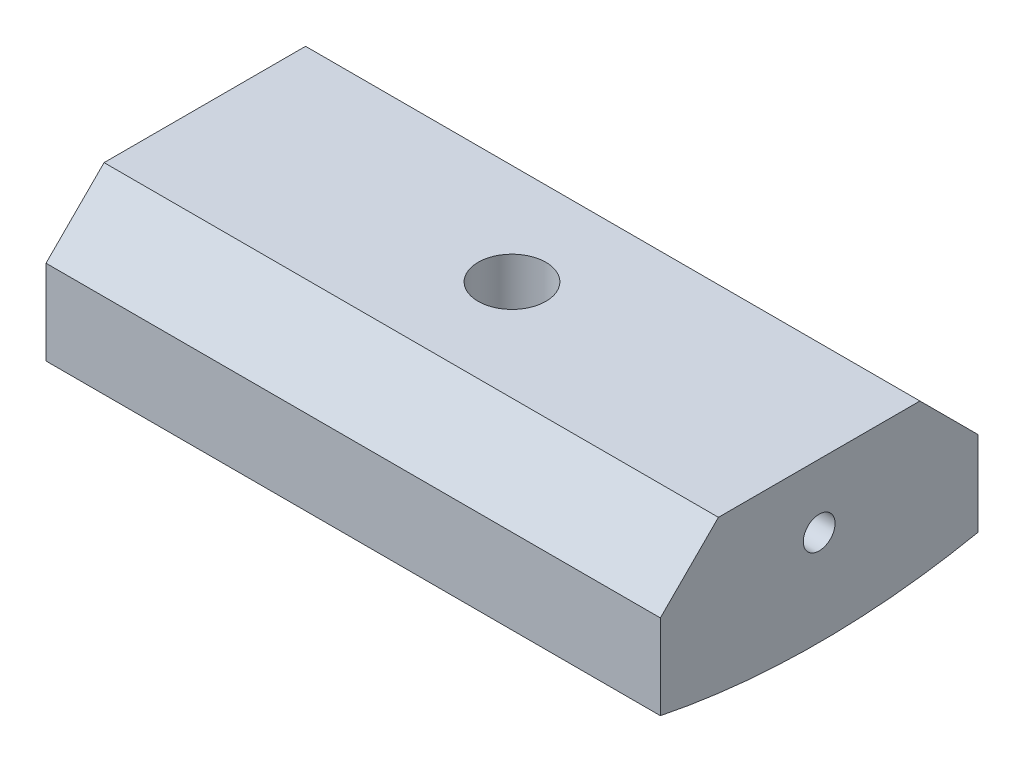
ISO-10303-21;
HEADER;
FILE_DESCRIPTION(('STEP AP214'),'2;1');
FILE_NAME('part.step','',(''),(''),'','','');
FILE_SCHEMA(('AUTOMOTIVE_DESIGN { 1 0 10303 214 1 1 1 1 }'));
ENDSEC;
DATA;
#1=APPLICATION_CONTEXT('core data for automotive mechanical design processes');
#2=APPLICATION_PROTOCOL_DEFINITION('international standard','automotive_design',2000,#1);
#3=PRODUCT_CONTEXT('',#1,'mechanical');
#4=PRODUCT('Part','Part','',(#3));
#5=PRODUCT_RELATED_PRODUCT_CATEGORY('part','',(#4));
#6=PRODUCT_DEFINITION_FORMATION('','',#4);
#7=PRODUCT_DEFINITION_CONTEXT('part definition',#1,'design');
#8=PRODUCT_DEFINITION('design','',#6,#7);
#9=PRODUCT_DEFINITION_SHAPE('','',#8);
#10=(LENGTH_UNIT() NAMED_UNIT(*) SI_UNIT(.MILLI.,.METRE.));
#11=(NAMED_UNIT(*) PLANE_ANGLE_UNIT() SI_UNIT($,.RADIAN.));
#12=(NAMED_UNIT(*) SI_UNIT($,.STERADIAN.) SOLID_ANGLE_UNIT());
#13=UNCERTAINTY_MEASURE_WITH_UNIT(LENGTH_MEASURE(1.E-05),#10,'distance_accuracy_value','');
#14=(GEOMETRIC_REPRESENTATION_CONTEXT(3) GLOBAL_UNCERTAINTY_ASSIGNED_CONTEXT((#13)) GLOBAL_UNIT_ASSIGNED_CONTEXT((#10,
#11,#12)) REPRESENTATION_CONTEXT('',''));
#15=CARTESIAN_POINT('',(0.,0.,0.));
#16=DIRECTION('',(0.,0.,1.));
#17=DIRECTION('',(1.,0.,0.));
#18=AXIS2_PLACEMENT_3D('',#15,#16,#17);
#19=CARTESIAN_POINT('',(58.024,-65.4846922834953,-15.));
#20=DIRECTION('',(0.,-0.707106781186551,0.707106781186544));
#21=DIRECTION('',(0.,-0.707106781186544,-0.707106781186551));
#22=AXIS2_PLACEMENT_3D('',#19,#20,#21);
#23=PLANE('',#22);
#24=DIRECTION('',(0.,0.707106781186544,0.707106781186551));
#25=VECTOR('',#24,1.);
#26=CARTESIAN_POINT('',(0.,-65.4846922834953,-15.));
#27=LINE('',#26,#25);
#28=CARTESIAN_POINT('',(0.,-65.4846922834953,-15.));
#29=VERTEX_POINT('',#28);
#30=CARTESIAN_POINT('',(0.,-60.,-9.5153077165046));
#31=VERTEX_POINT('',#30);
#32=EDGE_CURVE('E122',#29,#31,#27,.T.);
#33=ORIENTED_EDGE('',*,*,#32,.T.);
#34=DIRECTION('',(-1.,0.,0.));
#35=VECTOR('',#34,1.);
#36=CARTESIAN_POINT('',(58.024,-60.,-9.5153077165046));
#37=LINE('',#36,#35);
#38=CARTESIAN_POINT('',(58.024,-60.,-9.5153077165046));
#39=VERTEX_POINT('',#38);
#40=EDGE_CURVE('E45',#39,#31,#37,.T.);
#41=ORIENTED_EDGE('',*,*,#40,.F.);
#42=DIRECTION('',(0.,0.707106781186544,0.707106781186551));
#43=VECTOR('',#42,1.);
#44=CARTESIAN_POINT('',(58.024,-65.4846922834953,-15.));
#45=LINE('',#44,#43);
#46=CARTESIAN_POINT('',(58.024,-65.4846922834953,-15.));
#47=VERTEX_POINT('',#46);
#48=EDGE_CURVE('E133',#47,#39,#45,.T.);
#49=ORIENTED_EDGE('',*,*,#48,.F.);
#50=DIRECTION('',(-1.,0.,0.));
#51=VECTOR('',#50,1.);
#52=CARTESIAN_POINT('',(58.024,-65.4846922834953,-15.));
#53=LINE('',#52,#51);
#54=EDGE_CURVE('E118',#47,#29,#53,.T.);
#55=ORIENTED_EDGE('',*,*,#54,.T.);
#56=EDGE_LOOP('',(#33,#41,#49,#55));
#57=FACE_BOUND('',#56,.T.);
#58=ADVANCED_FACE('F33',(#57),#23,.F.);
#59=CARTESIAN_POINT('',(58.024,-60.,0.));
#60=DIRECTION('',(0.,-1.,0.));
#61=DIRECTION('',(0.,0.,-1.));
#62=AXIS2_PLACEMENT_3D('',#59,#60,#61);
#63=PLANE('',#62);
#64=CARTESIAN_POINT('',(29.012,-60.,0.));
#65=DIRECTION('',(0.,1.,0.));
#66=DIRECTION('',(0.,0.,1.));
#67=AXIS2_PLACEMENT_3D('',#64,#65,#66);
#68=CIRCLE('',#67,3.20000000000001);
#69=CARTESIAN_POINT('',(29.012,-60.,3.20000000000002));
#70=VERTEX_POINT('',#69);
#71=EDGE_CURVE('E126',#70,#70,#68,.T.);
#72=ORIENTED_EDGE('',*,*,#71,.F.);
#73=EDGE_LOOP('',(#72));
#74=FACE_BOUND('',#73,.T.);
#75=DIRECTION('',(0.,0.,1.));
#76=VECTOR('',#75,1.);
#77=CARTESIAN_POINT('',(0.,-60.,0.));
#78=LINE('',#77,#76);
#79=CARTESIAN_POINT('',(0.,-60.,9.51530771650459));
#80=VERTEX_POINT('',#79);
#81=EDGE_CURVE('E125',#31,#80,#78,.T.);
#82=ORIENTED_EDGE('',*,*,#81,.T.);
#83=DIRECTION('',(-1.,0.,0.));
#84=VECTOR('',#83,1.);
#85=CARTESIAN_POINT('',(58.024,-60.,9.51530771650459));
#86=LINE('',#85,#84);
#87=CARTESIAN_POINT('',(58.024,-60.,9.51530771650459));
#88=VERTEX_POINT('',#87);
#89=EDGE_CURVE('E137',#88,#80,#86,.T.);
#90=ORIENTED_EDGE('',*,*,#89,.F.);
#91=DIRECTION('',(0.,0.,1.));
#92=VECTOR('',#91,1.);
#93=CARTESIAN_POINT('',(58.024,-60.,-9.5153077165046));
#94=LINE('',#93,#92);
#95=EDGE_CURVE('E91',#39,#88,#94,.T.);
#96=ORIENTED_EDGE('',*,*,#95,.F.);
#97=ORIENTED_EDGE('',*,*,#40,.T.);
#98=EDGE_LOOP('',(#82,#90,#96,#97));
#99=FACE_BOUND('',#98,.T.);
#100=ADVANCED_FACE('F140',(#74,#99),#63,.F.);
#101=CARTESIAN_POINT('',(58.024,-60.,9.51530771650459));
#102=DIRECTION('',(0.,-0.707106781186551,-0.707106781186544));
#103=DIRECTION('',(0.,0.707106781186544,-0.707106781186551));
#104=AXIS2_PLACEMENT_3D('',#101,#102,#103);
#105=PLANE('',#104);
#106=DIRECTION('',(0.,-0.707106781186544,0.707106781186551));
#107=VECTOR('',#106,1.);
#108=CARTESIAN_POINT('',(0.,-60.,9.51530771650459));
#109=LINE('',#108,#107);
#110=CARTESIAN_POINT('',(0.,-65.4846922834953,15.));
#111=VERTEX_POINT('',#110);
#112=EDGE_CURVE('E128',#80,#111,#109,.T.);
#113=ORIENTED_EDGE('',*,*,#112,.T.);
#114=DIRECTION('',(-1.,0.,0.));
#115=VECTOR('',#114,1.);
#116=CARTESIAN_POINT('',(58.024,-65.4846922834953,15.));
#117=LINE('',#116,#115);
#118=CARTESIAN_POINT('',(58.024,-65.4846922834953,15.));
#119=VERTEX_POINT('',#118);
#120=EDGE_CURVE('E113',#119,#111,#117,.T.);
#121=ORIENTED_EDGE('',*,*,#120,.F.);
#122=DIRECTION('',(0.,-0.707106781186544,0.707106781186551));
#123=VECTOR('',#122,1.);
#124=CARTESIAN_POINT('',(58.024,-60.,9.51530771650459));
#125=LINE('',#124,#123);
#126=EDGE_CURVE('E104',#88,#119,#125,.T.);
#127=ORIENTED_EDGE('',*,*,#126,.F.);
#128=ORIENTED_EDGE('',*,*,#89,.T.);
#129=EDGE_LOOP('',(#113,#121,#127,#128));
#130=FACE_BOUND('',#129,.T.);
#131=ADVANCED_FACE('F148',(#130),#105,.F.);
#132=CARTESIAN_POINT('',(58.024,-65.4846922834953,15.));
#133=DIRECTION('',(0.,0.,-1.));
#134=DIRECTION('',(0.,1.,0.));
#135=AXIS2_PLACEMENT_3D('',#132,#133,#134);
#136=PLANE('',#135);
#137=DIRECTION('',(0.,-1.,0.));
#138=VECTOR('',#137,1.);
#139=CARTESIAN_POINT('',(0.,-65.4846922834953,15.));
#140=LINE('',#139,#138);
#141=CARTESIAN_POINT('',(0.,-73.4846922834954,15.));
#142=VERTEX_POINT('',#141);
#143=EDGE_CURVE('E112',#111,#142,#140,.T.);
#144=ORIENTED_EDGE('',*,*,#143,.T.);
#145=DIRECTION('',(-1.,0.,0.));
#146=VECTOR('',#145,1.);
#147=CARTESIAN_POINT('',(58.024,-73.4846922834954,15.));
#148=LINE('',#147,#146);
#149=CARTESIAN_POINT('',(58.024,-73.4846922834954,15.));
#150=VERTEX_POINT('',#149);
#151=EDGE_CURVE('E109',#150,#142,#148,.T.);
#152=ORIENTED_EDGE('',*,*,#151,.F.);
#153=DIRECTION('',(0.,-1.,0.));
#154=VECTOR('',#153,1.);
#155=CARTESIAN_POINT('',(58.024,-65.4846922834953,15.));
#156=LINE('',#155,#154);
#157=EDGE_CURVE('E98',#119,#150,#156,.T.);
#158=ORIENTED_EDGE('',*,*,#157,.F.);
#159=ORIENTED_EDGE('',*,*,#120,.T.);
#160=EDGE_LOOP('',(#144,#152,#158,#159));
#161=FACE_BOUND('',#160,.T.);
#162=ADVANCED_FACE('F110',(#161),#136,.F.);
#163=CARTESIAN_POINT('',(58.024,0.,0.));
#164=DIRECTION('',(-1.,0.,0.));
#165=DIRECTION('',(0.,0.,1.));
#166=AXIS2_PLACEMENT_3D('',#163,#164,#165);
#167=CYLINDRICAL_SURFACE('',#166,75.);
#168=CARTESIAN_POINT('',(25.812,-75.,0.));
#169=CARTESIAN_POINT('',(25.8120079397176,-74.9999990839254,0.179657696072669));
#170=CARTESIAN_POINT('',(25.827180593436,-74.9993475436816,0.359443578258337));
#171=CARTESIAN_POINT('',(25.8874934016503,-74.9968110562277,0.714057931367362));
#172=CARTESIAN_POINT('',(25.9326690719867,-74.9949246472892,0.888880270683551));
#173=CARTESIAN_POINT('',(26.0516941335526,-74.9901319836624,1.22837914030276));
#174=CARTESIAN_POINT('',(26.1255291603168,-74.9872262399488,1.39306070546766));
#175=CARTESIAN_POINT('',(26.2997555704953,-74.9807223779135,1.70764684826442));
#176=CARTESIAN_POINT('',(26.4001405942766,-74.9771244254556,1.85755495285802));
#177=CARTESIAN_POINT('',(26.6247052078495,-74.9696379361872,2.13850026673792));
#178=CARTESIAN_POINT('',(26.7489007495504,-74.9657492056407,2.26952472120714));
#179=CARTESIAN_POINT('',(27.0175300822575,-74.9581211261534,2.50887509234558));
#180=CARTESIAN_POINT('',(27.1619646906946,-74.954381783254,2.61720009177065));
#181=CARTESIAN_POINT('',(27.4670342380844,-74.9474728827123,2.8081079852311));
#182=CARTESIAN_POINT('',(27.6276750547235,-74.9443035329637,2.89068149494296));
#183=CARTESIAN_POINT('',(27.9605555148053,-74.9388942336831,3.02768206955581));
#184=CARTESIAN_POINT('',(28.1327950878811,-74.9366542785133,3.08210930519623));
#185=CARTESIAN_POINT('',(28.4838716589105,-74.9333580216569,3.16124020661874));
#186=CARTESIAN_POINT('',(28.6627045370831,-74.9323009933529,3.18596211969958));
#187=CARTESIAN_POINT('',(29.0219848596763,-74.9314876006178,3.20503688785258));
#188=CARTESIAN_POINT('',(29.202432294024,-74.931731228078,3.19938993225503));
#189=CARTESIAN_POINT('',(29.5596955877109,-74.9334909976567,3.15790251371727));
#190=CARTESIAN_POINT('',(29.7365137403809,-74.9350063091477,3.12208175938013));
#191=CARTESIAN_POINT('',(30.0816248283348,-74.9391373356094,3.0212940875178));
#192=CARTESIAN_POINT('',(30.2499177349051,-74.9417530542861,2.95632707183385));
#193=CARTESIAN_POINT('',(30.573264636987,-74.9477910170992,2.7990684882033));
#194=CARTESIAN_POINT('',(30.7283142470405,-74.9512135270012,2.70676791372333));
#195=CARTESIAN_POINT('',(31.020725265584,-74.9584790195515,2.49746888232949));
#196=CARTESIAN_POINT('',(31.1580865850674,-74.9623220043154,2.38047030114422));
#197=CARTESIAN_POINT('',(31.4113365791973,-74.9699989664138,2.12498508960095));
#198=CARTESIAN_POINT('',(31.5272080301309,-74.9738329341122,1.98648138523391));
#199=CARTESIAN_POINT('',(31.7340564536336,-74.9810567470476,1.69197763004663));
#200=CARTESIAN_POINT('',(31.8250334210752,-74.984446592193,1.53597757562261));
#201=CARTESIAN_POINT('',(31.9795086167198,-74.9904001863566,1.21089951469084));
#202=CARTESIAN_POINT('',(32.0430062689044,-74.9929639180576,1.04182123412625));
#203=CARTESIAN_POINT('',(32.140709223733,-74.9969760611096,0.695390626807282));
#204=CARTESIAN_POINT('',(32.1749146863722,-74.9984244785526,0.518038345251422));
#205=CARTESIAN_POINT('',(32.2130411187766,-75.0000419586156,0.16024369786051));
#206=CARTESIAN_POINT('',(32.2169859163474,-75.0002120278284,-0.0201961245492643));
#207=CARTESIAN_POINT('',(32.1945411858468,-74.9992563128343,-0.379175279954684));
#208=CARTESIAN_POINT('',(32.1681517303827,-74.9981305317291,-0.557714617498248));
#209=CARTESIAN_POINT('',(32.085807313869,-74.9947105963724,-0.907758108651847));
#210=CARTESIAN_POINT('',(32.0298632069706,-74.9924168710677,-1.07926482014026));
#211=CARTESIAN_POINT('',(31.8900085382405,-74.9869193844431,-1.41045330929206));
#212=CARTESIAN_POINT('',(31.8060978597136,-74.9837156193259,-1.57013503761032));
#213=CARTESIAN_POINT('',(31.6126308018683,-74.9767561636497,-1.87325031412464));
#214=CARTESIAN_POINT('',(31.5030584222019,-74.973000129291,-2.01667364189423));
#215=CARTESIAN_POINT('',(31.2614017440061,-74.9653604146649,-2.28309814421232));
#216=CARTESIAN_POINT('',(31.1293173380867,-74.9614767337889,-2.40609922133427));
#217=CARTESIAN_POINT('',(30.8462836523593,-74.9540166297352,-2.62826763313193));
#218=CARTESIAN_POINT('',(30.6953222801707,-74.9504404060119,-2.72741957019759));
#219=CARTESIAN_POINT('',(30.378881203765,-74.9440015901174,-2.89896992099374));
#220=CARTESIAN_POINT('',(30.2134015498541,-74.9411389954736,-2.97136842742073));
#221=CARTESIAN_POINT('',(29.8726787063661,-74.9364516408955,-3.08732986683399));
#222=CARTESIAN_POINT('',(29.6974388835114,-74.9346265254927,-3.13090267712852));
#223=CARTESIAN_POINT('',(29.3421228027593,-74.9322189260286,-3.18800818324777));
#224=CARTESIAN_POINT('',(29.162046562446,-74.93163643745,-3.20154098827785));
#225=CARTESIAN_POINT('',(28.8023228129619,-74.9317798982018,-3.19818120950429));
#226=CARTESIAN_POINT('',(28.6226750764908,-74.9325048051934,-3.18131286343336));
#227=CARTESIAN_POINT('',(28.268764294782,-74.9351791484225,-3.11767962920046));
#228=CARTESIAN_POINT('',(28.0945012600037,-74.9371285870383,-3.07091468296979));
#229=CARTESIAN_POINT('',(27.7563004258569,-74.9420320421565,-2.94882028523572));
#230=CARTESIAN_POINT('',(27.5923627529531,-74.9449860709602,-2.87349048395038));
#231=CARTESIAN_POINT('',(27.279461636943,-74.9515656276475,-2.69640977755495));
#232=CARTESIAN_POINT('',(27.1304976998406,-74.9551911333673,-2.5946597444679));
#233=CARTESIAN_POINT('',(26.8516535440141,-74.9627082025894,-2.36754325924232));
#234=CARTESIAN_POINT('',(26.7217865508366,-74.9665999477677,-2.2421605762112));
#235=CARTESIAN_POINT('',(26.4849065775872,-74.9742098588917,-1.97133613133246));
#236=CARTESIAN_POINT('',(26.3778992430973,-74.9779279817816,-1.82588942889607));
#237=CARTESIAN_POINT('',(26.1897397383859,-74.9847736326847,-1.5189759616952));
#238=CARTESIAN_POINT('',(26.1086089858696,-74.9879006705972,-1.35749607066747));
#239=CARTESIAN_POINT('',(25.9747064087682,-74.9932039183901,-1.02331609085443));
#240=CARTESIAN_POINT('',(25.921900951464,-74.9953812553438,-0.850629582975623));
#241=CARTESIAN_POINT('',(25.8600597303107,-74.997961295745,-0.56405205247366));
#242=CARTESIAN_POINT('',(25.84206019904,-74.9987224681443,-0.452018952422676));
#243=CARTESIAN_POINT('',(25.8180278325863,-74.9997421091364,-0.226674246888383));
#244=CARTESIAN_POINT('',(25.8119949900984,-75.0000005780361,-0.113362642185548));
#245=CARTESIAN_POINT('',(25.812,-75.,0.));
#246=B_SPLINE_CURVE_WITH_KNOTS('',3,(#168,#169,#170,#171,#172,#173,#174,#175,#176,#177,#178,
#179,#180,#181,#182,#183,#184,#185,#186,#187,#188,#189,#190,#191,#192,#193,#194,#195,#196,#197,
#198,#199,#200,#201,#202,#203,#204,#205,#206,#207,#208,#209,#210,#211,#212,#213,#214,#215,#216,
#217,#218,#219,#220,#221,#222,#223,#224,#225,#226,#227,#228,#229,#230,#231,#232,#233,#234,#235,
#236,#237,#238,#239,#240,#241,#242,#243,#244,#245),.UNSPECIFIED.,.T.,.F.,(4,2,2,2,2,2,2,2,2,2,2,
2,2,2,2,2,2,2,2,2,2,2,2,2,2,2,2,2,2,2,2,2,2,2,2,2,2,2,4),(0.,0.538559284093978,1.07775722260463,
1.61668525590909,2.15548431423771,2.69464561162541,3.23382869135167,3.77320803047232,
4.31258409759992,4.85162866871269,5.3906698792346,5.92935927727892,6.4680504895349,
7.00691940090071,7.54579102372373,8.08509269268841,8.62439447273481,9.16370755702055,
9.70301769553678,10.241903127674,10.7807872699517,11.3194736407219,11.8581622592798,
12.3971876544553,12.9362156210355,13.4755906692095,14.0149638485151,14.5541521123068,
15.0933384159673,15.6320950361332,16.1708527027389,16.7096169667451,17.248363450622,
17.7874813025455,18.3267321452703,18.8664281674677,19.4054819421201,19.7453089688555,
20.0851357881517),.UNSPECIFIED.);
#247=CARTESIAN_POINT('',(25.812,-75.,0.));
#248=VERTEX_POINT('',#247);
#249=EDGE_CURVE('E11',#248,#248,#246,.T.);
#250=ORIENTED_EDGE('',*,*,#249,.T.);
#251=EDGE_LOOP('',(#250));
#252=FACE_BOUND('',#251,.T.);
#253=CARTESIAN_POINT('',(0.,0.,0.));
#254=DIRECTION('',(1.,0.,0.));
#255=DIRECTION('',(0.,0.,-1.));
#256=AXIS2_PLACEMENT_3D('',#253,#254,#255);
#257=CIRCLE('',#256,75.);
#258=CARTESIAN_POINT('',(0.,-73.4846922834953,-15.));
#259=VERTEX_POINT('',#258);
#260=EDGE_CURVE('E76',#142,#259,#257,.T.);
#261=ORIENTED_EDGE('',*,*,#260,.T.);
#262=DIRECTION('',(-1.,0.,0.));
#263=VECTOR('',#262,1.);
#264=CARTESIAN_POINT('',(58.024,-73.4846922834953,-15.));
#265=LINE('',#264,#263);
#266=CARTESIAN_POINT('',(58.024,-73.4846922834953,-15.));
#267=VERTEX_POINT('',#266);
#268=EDGE_CURVE('E114',#267,#259,#265,.T.);
#269=ORIENTED_EDGE('',*,*,#268,.F.);
#270=CARTESIAN_POINT('',(58.024,0.,0.));
#271=DIRECTION('',(1.,0.,0.));
#272=DIRECTION('',(0.,0.,-1.));
#273=AXIS2_PLACEMENT_3D('',#270,#271,#272);
#274=CIRCLE('',#273,75.);
#275=EDGE_CURVE('E102',#150,#267,#274,.T.);
#276=ORIENTED_EDGE('',*,*,#275,.F.);
#277=ORIENTED_EDGE('',*,*,#151,.T.);
#278=EDGE_LOOP('',(#261,#269,#276,#277));
#279=FACE_BOUND('',#278,.T.);
#280=ADVANCED_FACE('F116',(#252,#279),#167,.T.);
#281=CARTESIAN_POINT('',(58.024,-73.4846922834953,-15.));
#282=DIRECTION('',(0.,0.,1.));
#283=DIRECTION('',(0.,-1.,0.));
#284=AXIS2_PLACEMENT_3D('',#281,#282,#283);
#285=PLANE('',#284);
#286=DIRECTION('',(0.,1.,0.));
#287=VECTOR('',#286,1.);
#288=CARTESIAN_POINT('',(0.,-73.4846922834953,-15.));
#289=LINE('',#288,#287);
#290=EDGE_CURVE('E82',#259,#29,#289,.T.);
#291=ORIENTED_EDGE('',*,*,#290,.T.);
#292=ORIENTED_EDGE('',*,*,#54,.F.);
#293=DIRECTION('',(0.,1.,0.));
#294=VECTOR('',#293,1.);
#295=CARTESIAN_POINT('',(58.024,-73.4846922834953,-15.));
#296=LINE('',#295,#294);
#297=EDGE_CURVE('E53',#267,#47,#296,.T.);
#298=ORIENTED_EDGE('',*,*,#297,.F.);
#299=ORIENTED_EDGE('',*,*,#268,.T.);
#300=EDGE_LOOP('',(#291,#292,#298,#299));
#301=FACE_BOUND('',#300,.T.);
#302=ADVANCED_FACE('F177',(#301),#285,.F.);
#303=CARTESIAN_POINT('',(58.024,0.,0.));
#304=DIRECTION('',(1.,0.,0.));
#305=DIRECTION('',(0.,0.,-1.));
#306=AXIS2_PLACEMENT_3D('',#303,#304,#305);
#307=PLANE('',#306);
#308=CARTESIAN_POINT('',(58.024,-66.,0.));
#309=DIRECTION('',(1.,0.,0.));
#310=DIRECTION('',(0.,0.,-1.));
#311=AXIS2_PLACEMENT_3D('',#308,#309,#310);
#312=CIRCLE('',#311,1.5);
#313=CARTESIAN_POINT('',(58.024,-66.,-1.50000000000001));
#314=VERTEX_POINT('',#313);
#315=EDGE_CURVE('E161',#314,#314,#312,.T.);
#316=ORIENTED_EDGE('',*,*,#315,.F.);
#317=EDGE_LOOP('',(#316));
#318=FACE_BOUND('',#317,.T.);
#319=ORIENTED_EDGE('',*,*,#48,.T.);
#320=ORIENTED_EDGE('',*,*,#95,.T.);
#321=ORIENTED_EDGE('',*,*,#126,.T.);
#322=ORIENTED_EDGE('',*,*,#157,.T.);
#323=ORIENTED_EDGE('',*,*,#275,.T.);
#324=ORIENTED_EDGE('',*,*,#297,.T.);
#325=EDGE_LOOP('',(#319,#320,#321,#322,#323,#324));
#326=FACE_BOUND('',#325,.T.);
#327=ADVANCED_FACE('F100',(#318,#326),#307,.T.);
#328=CARTESIAN_POINT('',(0.,0.,0.));
#329=DIRECTION('',(1.,0.,0.));
#330=DIRECTION('',(0.,0.,-1.));
#331=AXIS2_PLACEMENT_3D('',#328,#329,#330);
#332=PLANE('',#331);
#333=CARTESIAN_POINT('',(0.,-66.,0.));
#334=DIRECTION('',(1.,0.,0.));
#335=DIRECTION('',(0.,0.,-1.));
#336=AXIS2_PLACEMENT_3D('',#333,#334,#335);
#337=CIRCLE('',#336,1.5);
#338=CARTESIAN_POINT('',(0.,-66.,-1.50000000000001));
#339=VERTEX_POINT('',#338);
#340=EDGE_CURVE('E155',#339,#339,#337,.T.);
#341=ORIENTED_EDGE('',*,*,#340,.T.);
#342=EDGE_LOOP('',(#341));
#343=FACE_BOUND('',#342,.T.);
#344=ORIENTED_EDGE('',*,*,#32,.F.);
#345=ORIENTED_EDGE('',*,*,#290,.F.);
#346=ORIENTED_EDGE('',*,*,#260,.F.);
#347=ORIENTED_EDGE('',*,*,#143,.F.);
#348=ORIENTED_EDGE('',*,*,#112,.F.);
#349=ORIENTED_EDGE('',*,*,#81,.F.);
#350=EDGE_LOOP('',(#344,#345,#346,#347,#348,#349));
#351=FACE_BOUND('',#350,.T.);
#352=ADVANCED_FACE('F145',(#343,#351),#332,.F.);
#353=CARTESIAN_POINT('',(29.012,-75.,0.));
#354=DIRECTION('',(0.,1.,0.));
#355=DIRECTION('',(0.,0.,1.));
#356=AXIS2_PLACEMENT_3D('',#353,#354,#355);
#357=CYLINDRICAL_SURFACE('',#356,3.20000000000001);
#358=ORIENTED_EDGE('',*,*,#71,.T.);
#359=EDGE_LOOP('',(#358));
#360=FACE_BOUND('',#359,.T.);
#361=ORIENTED_EDGE('',*,*,#249,.F.);
#362=EDGE_LOOP('',(#361));
#363=FACE_BOUND('',#362,.T.);
#364=ADVANCED_FACE('F183',(#360,#363),#357,.F.);
#365=CARTESIAN_POINT('',(5.,-66.,0.));
#366=DIRECTION('',(-1.,0.,0.));
#367=DIRECTION('',(0.,0.,1.));
#368=AXIS2_PLACEMENT_3D('',#365,#366,#367);
#369=CYLINDRICAL_SURFACE('',#368,1.5);
#370=CARTESIAN_POINT('',(5.,-66.,0.));
#371=DIRECTION('',(1.,0.,0.));
#372=DIRECTION('',(0.,0.,-1.));
#373=AXIS2_PLACEMENT_3D('',#370,#371,#372);
#374=CIRCLE('',#373,1.5);
#375=CARTESIAN_POINT('',(5.,-66.,-1.50000000000001));
#376=VERTEX_POINT('',#375);
#377=EDGE_CURVE('E154',#376,#376,#374,.T.);
#378=ORIENTED_EDGE('',*,*,#377,.T.);
#379=EDGE_LOOP('',(#378));
#380=FACE_BOUND('',#379,.T.);
#381=ORIENTED_EDGE('',*,*,#340,.F.);
#382=EDGE_LOOP('',(#381));
#383=FACE_BOUND('',#382,.T.);
#384=ADVANCED_FACE('F207',(#380,#383),#369,.F.);
#385=CARTESIAN_POINT('',(5.,-66.,0.));
#386=DIRECTION('',(1.,0.,0.));
#387=DIRECTION('',(0.,0.,-1.));
#388=AXIS2_PLACEMENT_3D('',#385,#386,#387);
#389=PLANE('',#388);
#390=ORIENTED_EDGE('',*,*,#377,.F.);
#391=EDGE_LOOP('',(#390));
#392=FACE_BOUND('',#391,.T.);
#393=ADVANCED_FACE('F172',(#392),#389,.F.);
#394=CARTESIAN_POINT('',(53.024,-66.,0.));
#395=DIRECTION('',(1.,0.,0.));
#396=DIRECTION('',(0.,0.,-1.));
#397=AXIS2_PLACEMENT_3D('',#394,#395,#396);
#398=CYLINDRICAL_SURFACE('',#397,1.5);
#399=CARTESIAN_POINT('',(53.024,-66.,0.));
#400=DIRECTION('',(1.,0.,0.));
#401=DIRECTION('',(0.,0.,-1.));
#402=AXIS2_PLACEMENT_3D('',#399,#400,#401);
#403=CIRCLE('',#402,1.5);
#404=CARTESIAN_POINT('',(53.024,-66.,-1.50000000000001));
#405=VERTEX_POINT('',#404);
#406=EDGE_CURVE('E158',#405,#405,#403,.T.);
#407=ORIENTED_EDGE('',*,*,#406,.F.);
#408=EDGE_LOOP('',(#407));
#409=FACE_BOUND('',#408,.T.);
#410=ORIENTED_EDGE('',*,*,#315,.T.);
#411=EDGE_LOOP('',(#410));
#412=FACE_BOUND('',#411,.T.);
#413=ADVANCED_FACE('F169',(#409,#412),#398,.F.);
#414=CARTESIAN_POINT('',(53.024,-66.,0.));
#415=DIRECTION('',(1.,0.,0.));
#416=DIRECTION('',(0.,0.,-1.));
#417=AXIS2_PLACEMENT_3D('',#414,#415,#416);
#418=PLANE('',#417);
#419=ORIENTED_EDGE('',*,*,#406,.T.);
#420=EDGE_LOOP('',(#419));
#421=FACE_BOUND('',#420,.T.);
#422=ADVANCED_FACE('F167',(#421),#418,.T.);
#423=CLOSED_SHELL('',(#58,#100,#131,#162,#280,#302,#327,#352,#364,#384,#393,#413,#422));
#424=MANIFOLD_SOLID_BREP('B2',#423);
#425=ADVANCED_BREP_SHAPE_REPRESENTATION('',(#18,#424),#14);
#426=SHAPE_DEFINITION_REPRESENTATION(#9,#425);
ENDSEC;
END-ISO-10303-21;
